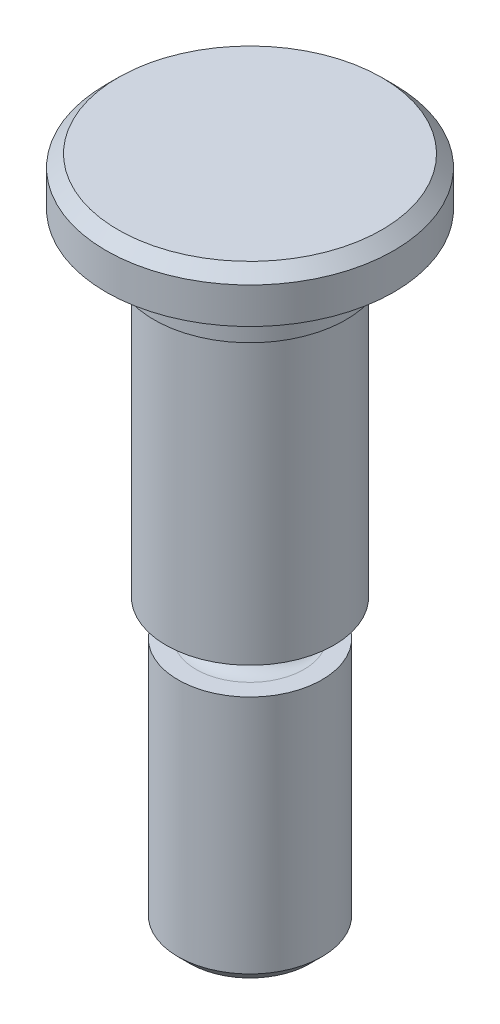
ISO-10303-21;
HEADER;
FILE_DESCRIPTION(('STEP AP214'),'2;1');
FILE_NAME('part.step','',(''),(''),'','','');
FILE_SCHEMA(('AUTOMOTIVE_DESIGN { 1 0 10303 214 1 1 1 1 }'));
ENDSEC;
DATA;
#1=APPLICATION_CONTEXT('core data for automotive mechanical design processes');
#2=APPLICATION_PROTOCOL_DEFINITION('international standard','automotive_design',2000,#1);
#3=PRODUCT_CONTEXT('',#1,'mechanical');
#4=PRODUCT('Part','Part','',(#3));
#5=PRODUCT_RELATED_PRODUCT_CATEGORY('part','',(#4));
#6=PRODUCT_DEFINITION_FORMATION('','',#4);
#7=PRODUCT_DEFINITION_CONTEXT('part definition',#1,'design');
#8=PRODUCT_DEFINITION('design','',#6,#7);
#9=PRODUCT_DEFINITION_SHAPE('','',#8);
#10=(LENGTH_UNIT() NAMED_UNIT(*) SI_UNIT(.MILLI.,.METRE.));
#11=(NAMED_UNIT(*) PLANE_ANGLE_UNIT() SI_UNIT($,.RADIAN.));
#12=(NAMED_UNIT(*) SI_UNIT($,.STERADIAN.) SOLID_ANGLE_UNIT());
#13=UNCERTAINTY_MEASURE_WITH_UNIT(LENGTH_MEASURE(1.E-05),#10,'distance_accuracy_value','');
#14=(GEOMETRIC_REPRESENTATION_CONTEXT(3) GLOBAL_UNCERTAINTY_ASSIGNED_CONTEXT((#13)) GLOBAL_UNIT_ASSIGNED_CONTEXT((#10,
#11,#12)) REPRESENTATION_CONTEXT('',''));
#15=CARTESIAN_POINT('',(0.,0.,0.));
#16=DIRECTION('',(0.,0.,1.));
#17=DIRECTION('',(1.,0.,0.));
#18=AXIS2_PLACEMENT_3D('',#15,#16,#17);
#19=CARTESIAN_POINT('',(0.,28.,-1.2490009027033E-13));
#20=DIRECTION('',(0.,-1.,0.));
#21=DIRECTION('',(0.,0.,-0.999999999999999));
#22=AXIS2_PLACEMENT_3D('',#19,#20,#21);
#23=PLANE('',#22);
#24=CARTESIAN_POINT('',(0.,28.,-1.2490009027033E-13));
#25=DIRECTION('',(0.,-1.,0.));
#26=DIRECTION('',(0.,0.,-0.999999999999999));
#27=AXIS2_PLACEMENT_3D('',#24,#25,#26);
#28=CIRCLE('',#27,5.49999999999999);
#29=CARTESIAN_POINT('',(0.,28.,-5.50000000000011));
#30=VERTEX_POINT('',#29);
#31=EDGE_CURVE('E40',#30,#30,#28,.F.);
#32=ORIENTED_EDGE('',*,*,#31,.T.);
#33=EDGE_LOOP('',(#32));
#34=FACE_BOUND('',#33,.T.);
#35=ADVANCED_FACE('F30',(#34),#23,.F.);
#36=CARTESIAN_POINT('',(0.,0.,0.));
#37=DIRECTION('',(0.,-1.,0.));
#38=DIRECTION('',(0.,0.,-0.999999999999999));
#39=AXIS2_PLACEMENT_3D('',#36,#37,#38);
#40=CYLINDRICAL_SURFACE('',#39,5.99999999999999);
#41=CARTESIAN_POINT('',(0.,27.5,-1.80411241501588E-13));
#42=DIRECTION('',(0.,-1.,0.));
#43=DIRECTION('',(0.,0.,-0.999999999999999));
#44=AXIS2_PLACEMENT_3D('',#41,#42,#43);
#45=CIRCLE('',#44,5.99999999999999);
#46=CARTESIAN_POINT('',(0.,27.5,-6.00000000000017));
#47=VERTEX_POINT('',#46);
#48=EDGE_CURVE('E44',#47,#47,#45,.T.);
#49=ORIENTED_EDGE('',*,*,#48,.T.);
#50=EDGE_LOOP('',(#49));
#51=FACE_BOUND('',#50,.T.);
#52=CARTESIAN_POINT('',(0.,26.,-1.80411241501588E-13));
#53=DIRECTION('',(0.,-1.,0.));
#54=DIRECTION('',(0.,0.,-0.999999999999999));
#55=AXIS2_PLACEMENT_3D('',#52,#53,#54);
#56=CIRCLE('',#55,5.99999999999999);
#57=CARTESIAN_POINT('',(0.,26.,-6.00000000000017));
#58=VERTEX_POINT('',#57);
#59=EDGE_CURVE('E49',#58,#58,#56,.T.);
#60=ORIENTED_EDGE('',*,*,#59,.F.);
#61=EDGE_LOOP('',(#60));
#62=FACE_BOUND('',#61,.T.);
#63=ADVANCED_FACE('F93',(#51,#62),#40,.T.);
#64=CARTESIAN_POINT('',(6.00000000000001,26.,0.));
#65=DIRECTION('',(0.,1.,0.));
#66=DIRECTION('',(0.,0.,0.999999999999999));
#67=AXIS2_PLACEMENT_3D('',#64,#65,#66);
#68=PLANE('',#67);
#69=CARTESIAN_POINT('',(0.,26.,-1.80411241501588E-13));
#70=DIRECTION('',(0.,-1.,0.));
#71=DIRECTION('',(0.,0.,-0.999999999999999));
#72=AXIS2_PLACEMENT_3D('',#69,#70,#71);
#73=CIRCLE('',#72,3.99999999999999);
#74=CARTESIAN_POINT('',(0.,26.,-4.00000000000017));
#75=VERTEX_POINT('',#74);
#76=EDGE_CURVE('E52',#75,#75,#73,.T.);
#77=ORIENTED_EDGE('',*,*,#76,.F.);
#78=EDGE_LOOP('',(#77));
#79=FACE_BOUND('',#78,.T.);
#80=ORIENTED_EDGE('',*,*,#59,.T.);
#81=EDGE_LOOP('',(#80));
#82=FACE_BOUND('',#81,.T.);
#83=ADVANCED_FACE('F98',(#79,#82),#68,.F.);
#84=CARTESIAN_POINT('',(0.,0.,0.));
#85=DIRECTION('',(0.,-1.,0.));
#86=DIRECTION('',(0.,0.,-0.999999999999999));
#87=AXIS2_PLACEMENT_3D('',#84,#85,#86);
#88=CYLINDRICAL_SURFACE('',#87,3.99999999999999);
#89=CARTESIAN_POINT('',(0.,24.,0.));
#90=DIRECTION('',(0.,-1.,0.));
#91=DIRECTION('',(0.,0.,-0.999999999999999));
#92=AXIS2_PLACEMENT_3D('',#89,#90,#91);
#93=CIRCLE('',#92,3.99999999999999);
#94=CARTESIAN_POINT('',(0.,24.,-4.));
#95=VERTEX_POINT('',#94);
#96=EDGE_CURVE('E55',#95,#95,#93,.T.);
#97=ORIENTED_EDGE('',*,*,#96,.F.);
#98=EDGE_LOOP('',(#97));
#99=FACE_BOUND('',#98,.T.);
#100=ORIENTED_EDGE('',*,*,#76,.T.);
#101=EDGE_LOOP('',(#100));
#102=FACE_BOUND('',#101,.T.);
#103=ADVANCED_FACE('F107',(#99,#102),#88,.T.);
#104=CARTESIAN_POINT('',(4.,24.,0.));
#105=DIRECTION('',(0.,1.,0.));
#106=DIRECTION('',(0.,0.,0.999999999999999));
#107=AXIS2_PLACEMENT_3D('',#104,#105,#106);
#108=PLANE('',#107);
#109=CARTESIAN_POINT('',(0.,24.,0.));
#110=DIRECTION('',(0.,-1.,0.));
#111=DIRECTION('',(0.,0.,-0.999999999999999));
#112=AXIS2_PLACEMENT_3D('',#109,#110,#111);
#113=CIRCLE('',#112,3.49999999999999);
#114=CARTESIAN_POINT('',(0.,24.,-3.5));
#115=VERTEX_POINT('',#114);
#116=EDGE_CURVE('E58',#115,#115,#113,.T.);
#117=ORIENTED_EDGE('',*,*,#116,.F.);
#118=EDGE_LOOP('',(#117));
#119=FACE_BOUND('',#118,.T.);
#120=ORIENTED_EDGE('',*,*,#96,.T.);
#121=EDGE_LOOP('',(#120));
#122=FACE_BOUND('',#121,.T.);
#123=ADVANCED_FACE('F88',(#119,#122),#108,.F.);
#124=CARTESIAN_POINT('',(0.,0.,0.));
#125=DIRECTION('',(0.,-1.,0.));
#126=DIRECTION('',(0.,0.,-0.999999999999999));
#127=AXIS2_PLACEMENT_3D('',#124,#125,#126);
#128=CYLINDRICAL_SURFACE('',#127,3.49999999999999);
#129=CARTESIAN_POINT('',(0.,12.,0.));
#130=DIRECTION('',(0.,-1.,0.));
#131=DIRECTION('',(0.,0.,-0.999999999999999));
#132=AXIS2_PLACEMENT_3D('',#129,#130,#131);
#133=CIRCLE('',#132,3.49999999999999);
#134=CARTESIAN_POINT('',(0.,12.,-3.49999999999999));
#135=VERTEX_POINT('',#134);
#136=EDGE_CURVE('E61',#135,#135,#133,.T.);
#137=ORIENTED_EDGE('',*,*,#136,.F.);
#138=EDGE_LOOP('',(#137));
#139=FACE_BOUND('',#138,.T.);
#140=ORIENTED_EDGE('',*,*,#116,.T.);
#141=EDGE_LOOP('',(#140));
#142=FACE_BOUND('',#141,.T.);
#143=ADVANCED_FACE('F79',(#139,#142),#128,.T.);
#144=CARTESIAN_POINT('',(3.49999999999995,12.,0.));
#145=DIRECTION('',(0.,1.,0.));
#146=DIRECTION('',(0.,0.,0.999999999999999));
#147=AXIS2_PLACEMENT_3D('',#144,#145,#146);
#148=PLANE('',#147);
#149=ORIENTED_EDGE('',*,*,#136,.T.);
#150=EDGE_LOOP('',(#149));
#151=FACE_BOUND('',#150,.T.);
#152=CARTESIAN_POINT('',(0.,12.,0.));
#153=DIRECTION('',(0.,-1.,0.));
#154=DIRECTION('',(0.,0.,-0.999999999999999));
#155=AXIS2_PLACEMENT_3D('',#152,#153,#154);
#156=CIRCLE('',#155,2.25);
#157=CARTESIAN_POINT('',(0.,12.,-2.25));
#158=VERTEX_POINT('',#157);
#159=EDGE_CURVE('E70',#158,#158,#156,.T.);
#160=ORIENTED_EDGE('',*,*,#159,.F.);
#161=EDGE_LOOP('',(#160));
#162=FACE_BOUND('',#161,.T.);
#163=ADVANCED_FACE('F76',(#151,#162),#148,.F.);
#164=CARTESIAN_POINT('',(0.,27.5,-1.80411241501588E-13));
#165=DIRECTION('',(0.,-1.,0.));
#166=DIRECTION('',(0.,0.,-0.999999999999999));
#167=AXIS2_PLACEMENT_3D('',#164,#165,#166);
#168=CONICAL_SURFACE('',#167,5.99999999999999,0.785398163397445);
#169=ORIENTED_EDGE('',*,*,#31,.F.);
#170=EDGE_LOOP('',(#169));
#171=FACE_BOUND('',#170,.T.);
#172=ORIENTED_EDGE('',*,*,#48,.F.);
#173=EDGE_LOOP('',(#172));
#174=FACE_BOUND('',#173,.T.);
#175=ADVANCED_FACE('F78',(#171,#174),#168,.T.);
#176=CARTESIAN_POINT('',(0.,11.25,0.));
#177=DIRECTION('',(0.,-1.,0.));
#178=DIRECTION('',(0.,0.,-0.999999999999999));
#179=AXIS2_PLACEMENT_3D('',#176,#177,#178);
#180=TOROIDAL_SURFACE('',#179,2.25,0.75);
#181=CARTESIAN_POINT('',(0.,10.5,0.));
#182=DIRECTION('',(0.,-1.,0.));
#183=DIRECTION('',(0.,0.,-0.999999999999999));
#184=AXIS2_PLACEMENT_3D('',#181,#182,#183);
#185=CIRCLE('',#184,2.25);
#186=CARTESIAN_POINT('',(0.,10.5,-2.25));
#187=VERTEX_POINT('',#186);
#188=EDGE_CURVE('E64',#187,#187,#185,.T.);
#189=ORIENTED_EDGE('',*,*,#188,.F.);
#190=EDGE_LOOP('',(#189));
#191=FACE_BOUND('',#190,.T.);
#192=ORIENTED_EDGE('',*,*,#159,.T.);
#193=EDGE_LOOP('',(#192));
#194=FACE_BOUND('',#193,.T.);
#195=ADVANCED_FACE('F74',(#191,#194),#180,.F.);
#196=CARTESIAN_POINT('',(0.,10.5,-3.));
#197=DIRECTION('',(0.,1.,0.));
#198=DIRECTION('',(0.,0.,0.999999999999999));
#199=AXIS2_PLACEMENT_3D('',#196,#197,#198);
#200=PLANE('',#199);
#201=ORIENTED_EDGE('',*,*,#188,.T.);
#202=EDGE_LOOP('',(#201));
#203=FACE_BOUND('',#202,.T.);
#204=CARTESIAN_POINT('',(0.,10.5,0.));
#205=DIRECTION('',(0.,-1.,0.));
#206=DIRECTION('',(0.,0.,-0.999999999999999));
#207=AXIS2_PLACEMENT_3D('',#204,#205,#206);
#208=CIRCLE('',#207,3.);
#209=CARTESIAN_POINT('',(0.,10.5,-3.));
#210=VERTEX_POINT('',#209);
#211=EDGE_CURVE('E67',#210,#210,#208,.T.);
#212=ORIENTED_EDGE('',*,*,#211,.F.);
#213=EDGE_LOOP('',(#212));
#214=FACE_BOUND('',#213,.T.);
#215=ADVANCED_FACE('F155',(#203,#214),#200,.T.);
#216=CARTESIAN_POINT('',(3.,0.,0.));
#217=DIRECTION('',(0.,1.,0.));
#218=DIRECTION('',(0.,0.,0.999999999999999));
#219=AXIS2_PLACEMENT_3D('',#216,#217,#218);
#220=PLANE('',#219);
#221=CARTESIAN_POINT('',(0.,0.,0.));
#222=DIRECTION('',(0.,1.,0.));
#223=DIRECTION('',(0.,0.,0.999999999999999));
#224=AXIS2_PLACEMENT_3D('',#221,#222,#223);
#225=CIRCLE('',#224,2.49999999999998);
#226=CARTESIAN_POINT('',(0.,0.,2.49999999999998));
#227=VERTEX_POINT('',#226);
#228=EDGE_CURVE('E36',#227,#227,#225,.F.);
#229=ORIENTED_EDGE('',*,*,#228,.T.);
#230=EDGE_LOOP('',(#229));
#231=FACE_BOUND('',#230,.T.);
#232=ADVANCED_FACE('F165',(#231),#220,.F.);
#233=CARTESIAN_POINT('',(0.,0.,0.));
#234=DIRECTION('',(0.,1.,0.));
#235=DIRECTION('',(0.,0.,0.999999999999999));
#236=AXIS2_PLACEMENT_3D('',#233,#234,#235);
#237=CONICAL_SURFACE('',#236,2.49999999999998,0.785398163397453);
#238=CARTESIAN_POINT('',(0.,0.5,0.));
#239=DIRECTION('',(0.,1.,0.));
#240=DIRECTION('',(0.,0.,0.999999999999999));
#241=AXIS2_PLACEMENT_3D('',#238,#239,#240);
#242=CIRCLE('',#241,2.99999999999999);
#243=CARTESIAN_POINT('',(0.,0.5,2.99999999999999));
#244=VERTEX_POINT('',#243);
#245=EDGE_CURVE('E10',#244,#244,#242,.T.);
#246=ORIENTED_EDGE('',*,*,#245,.F.);
#247=EDGE_LOOP('',(#246));
#248=FACE_BOUND('',#247,.T.);
#249=ORIENTED_EDGE('',*,*,#228,.F.);
#250=EDGE_LOOP('',(#249));
#251=FACE_BOUND('',#250,.T.);
#252=ADVANCED_FACE('F174',(#248,#251),#237,.T.);
#253=CARTESIAN_POINT('',(0.,0.,0.));
#254=DIRECTION('',(0.,-1.,0.));
#255=DIRECTION('',(0.,0.,-0.999999999999999));
#256=AXIS2_PLACEMENT_3D('',#253,#254,#255);
#257=CYLINDRICAL_SURFACE('',#256,2.99999999999999);
#258=ORIENTED_EDGE('',*,*,#245,.T.);
#259=EDGE_LOOP('',(#258));
#260=FACE_BOUND('',#259,.T.);
#261=ORIENTED_EDGE('',*,*,#211,.T.);
#262=EDGE_LOOP('',(#261));
#263=FACE_BOUND('',#262,.T.);
#264=ADVANCED_FACE('F182',(#260,#263),#257,.T.);
#265=CLOSED_SHELL('',(#35,#63,#83,#103,#123,#143,#163,#175,#195,#215,#232,#252,#264));
#266=MANIFOLD_SOLID_BREP('B2',#265);
#267=ADVANCED_BREP_SHAPE_REPRESENTATION('',(#18,#266),#14);
#268=SHAPE_DEFINITION_REPRESENTATION(#9,#267);
ENDSEC;
END-ISO-10303-21;
